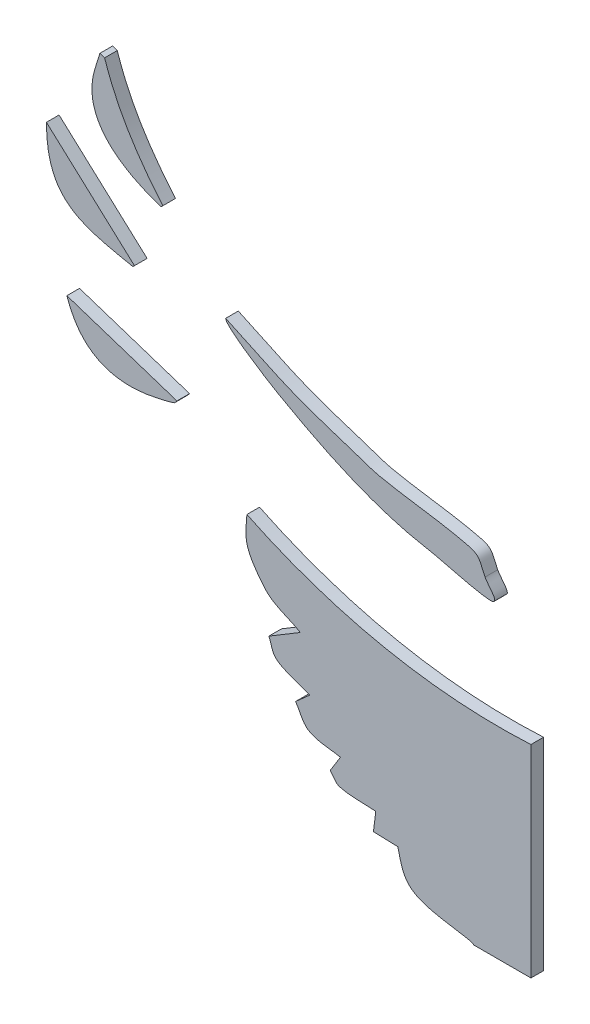
ISO-10303-21;
HEADER;
FILE_DESCRIPTION(('STEP AP214'),'2;1');
FILE_NAME('part.step','',(''),(''),'','','');
FILE_SCHEMA(('AUTOMOTIVE_DESIGN { 1 0 10303 214 1 1 1 1 }'));
ENDSEC;
DATA;
#1=APPLICATION_CONTEXT('core data for automotive mechanical design processes');
#2=APPLICATION_PROTOCOL_DEFINITION('international standard','automotive_design',2000,#1);
#3=PRODUCT_CONTEXT('',#1,'mechanical');
#4=PRODUCT('Part','Part','',(#3));
#5=PRODUCT_RELATED_PRODUCT_CATEGORY('part','',(#4));
#6=PRODUCT_DEFINITION_FORMATION('','',#4);
#7=PRODUCT_DEFINITION_CONTEXT('part definition',#1,'design');
#8=PRODUCT_DEFINITION('design','',#6,#7);
#9=PRODUCT_DEFINITION_SHAPE('','',#8);
#10=(LENGTH_UNIT() NAMED_UNIT(*) SI_UNIT(.MILLI.,.METRE.));
#11=(NAMED_UNIT(*) PLANE_ANGLE_UNIT() SI_UNIT($,.RADIAN.));
#12=(NAMED_UNIT(*) SI_UNIT($,.STERADIAN.) SOLID_ANGLE_UNIT());
#13=UNCERTAINTY_MEASURE_WITH_UNIT(LENGTH_MEASURE(1.E-05),#10,'distance_accuracy_value','');
#14=(GEOMETRIC_REPRESENTATION_CONTEXT(3) GLOBAL_UNCERTAINTY_ASSIGNED_CONTEXT((#13)) GLOBAL_UNIT_ASSIGNED_CONTEXT((#10,
#11,#12)) REPRESENTATION_CONTEXT('',''));
#15=CARTESIAN_POINT('',(0.,0.,0.));
#16=DIRECTION('',(0.,0.,1.));
#17=DIRECTION('',(1.,0.,0.));
#18=AXIS2_PLACEMENT_3D('',#15,#16,#17);
#19=CARTESIAN_POINT('',(-75.8399999999999,0.789999999999968,6.35));
#20=CARTESIAN_POINT('',(-78.7796213442979,6.6692426885958,6.35));
#21=CARTESIAN_POINT('',(-78.2156392015156,8.69140980037883,6.35));
#22=CARTESIAN_POINT('',(-84.53,10.27,6.35));
#23=CARTESIAN_POINT('',(-98.7672328266424,13.8293082066606,6.35));
#24=CARTESIAN_POINT('',(-114.58531411229,15.1611272359402,6.35));
#25=CARTESIAN_POINT('',(-128.77,18.17,6.35));
#26=CARTESIAN_POINT('',(-133.902676573185,19.25874957613,6.35));
#27=CARTESIAN_POINT('',(-138.769981558753,21.3513275960566,6.35));
#28=CARTESIAN_POINT('',(-143.78,22.9099999999999,6.35));
#29=CARTESIAN_POINT('',(-150.936267738309,25.136394407474,6.35));
#30=CARTESIAN_POINT('',(-158.036160998562,27.5441563494967,6.35));
#31=CARTESIAN_POINT('',(-165.11,30.02,6.35));
#32=CARTESIAN_POINT('',(-179.428985915574,35.0316450704508,6.35));
#33=CARTESIAN_POINT('',(-192.515030027746,42.1122355678873,6.35));
#34=CARTESIAN_POINT('',(-206.19,48.1899999999999,6.35));
#35=B_SPLINE_CURVE_WITH_KNOTS('',3,(#19,#20,#21,#22,#23,#24,#25,#26,#27,#28,#29,#30,#31,#32,#33,
#34),.UNSPECIFIED.,.F.,.F.,(4,3,3,3,3,4),(0.,1.,2.,3.,4.,5.),.UNSPECIFIED.);
#36=DIRECTION('',(0.,0.,-1.));
#37=VECTOR('',#36,1.);
#38=SURFACE_OF_LINEAR_EXTRUSION('',#35,#37);
#39=CARTESIAN_POINT('',(-75.8399999999999,0.789999999999968,0.));
#40=CARTESIAN_POINT('',(-78.7796213442979,6.6692426885958,0.));
#41=CARTESIAN_POINT('',(-78.2156392015156,8.69140980037883,0.));
#42=CARTESIAN_POINT('',(-84.53,10.27,0.));
#43=CARTESIAN_POINT('',(-98.7672328266424,13.8293082066606,0.));
#44=CARTESIAN_POINT('',(-114.58531411229,15.1611272359402,0.));
#45=CARTESIAN_POINT('',(-128.77,18.17,0.));
#46=CARTESIAN_POINT('',(-133.902676573185,19.25874957613,0.));
#47=CARTESIAN_POINT('',(-138.769981558753,21.3513275960566,0.));
#48=CARTESIAN_POINT('',(-143.78,22.9099999999999,0.));
#49=CARTESIAN_POINT('',(-150.936267738309,25.136394407474,0.));
#50=CARTESIAN_POINT('',(-158.036160998562,27.5441563494967,0.));
#51=CARTESIAN_POINT('',(-165.11,30.02,0.));
#52=CARTESIAN_POINT('',(-179.428985915574,35.0316450704508,0.));
#53=CARTESIAN_POINT('',(-192.515030027746,42.1122355678873,0.));
#54=CARTESIAN_POINT('',(-206.19,48.1899999999999,0.));
#55=B_SPLINE_CURVE_WITH_KNOTS('',3,(#39,#40,#41,#42,#43,#44,#45,#46,#47,#48,#49,#50,#51,#52,#53,
#54),.UNSPECIFIED.,.F.,.F.,(4,3,3,3,3,4),(0.,1.,2.,3.,4.,5.),.UNSPECIFIED.);
#56=CARTESIAN_POINT('',(-75.8399999999999,0.789999999999968,0.));
#57=VERTEX_POINT('',#56);
#58=CARTESIAN_POINT('',(-206.19,48.1899999999999,0.));
#59=VERTEX_POINT('',#58);
#60=EDGE_CURVE('E77',#57,#59,#55,.T.);
#61=ORIENTED_EDGE('',*,*,#60,.T.);
#62=DIRECTION('',(0.,0.,-1.));
#63=VECTOR('',#62,1.);
#64=CARTESIAN_POINT('',(-206.19,48.1899999999999,6.35));
#65=LINE('',#64,#63);
#66=CARTESIAN_POINT('',(-206.19,48.1899999999999,6.35));
#67=VERTEX_POINT('',#66);
#68=EDGE_CURVE('E12',#67,#59,#65,.T.);
#69=ORIENTED_EDGE('',*,*,#68,.F.);
#70=CARTESIAN_POINT('',(-75.8399999999999,0.789999999999968,6.35));
#71=VERTEX_POINT('',#70);
#72=EDGE_CURVE('E76',#71,#67,#35,.T.);
#73=ORIENTED_EDGE('',*,*,#72,.F.);
#74=DIRECTION('',(0.,0.,-1.));
#75=VECTOR('',#74,1.);
#76=CARTESIAN_POINT('',(-75.8399999999999,0.789999999999968,6.35));
#77=LINE('',#76,#75);
#78=EDGE_CURVE('E54',#71,#57,#77,.T.);
#79=ORIENTED_EDGE('',*,*,#78,.T.);
#80=EDGE_LOOP('',(#61,#69,#73,#79));
#81=FACE_BOUND('',#80,.T.);
#82=ADVANCED_FACE('F45',(#81),#38,.F.);
#83=CARTESIAN_POINT('',(-206.19,48.1899999999999,6.35));
#84=CARTESIAN_POINT('',(-206.19,44.7202303219831,6.35));
#85=CARTESIAN_POINT('',(-185.17030714785,31.6644612273428,6.35));
#86=CARTESIAN_POINT('',(-180.91,29.23,6.35));
#87=CARTESIAN_POINT('',(-160.26728455159,17.4341626009086,6.35));
#88=CARTESIAN_POINT('',(-138.429163031525,6.56229075788121,6.35));
#89=CARTESIAN_POINT('',(-115.34,0.789999999999968,6.35));
#90=CARTESIAN_POINT('',(-108.717916656089,-0.865520835977721,6.35));
#91=CARTESIAN_POINT('',(-106.320431811551,-0.872392047112246,6.35));
#92=CARTESIAN_POINT('',(-100.33,-2.37000000000001,6.35));
#93=CARTESIAN_POINT('',(-94.2252849477836,-3.89617876305413,6.35));
#94=CARTESIAN_POINT('',(-74.8655354359532,-8.94143740258369,6.35));
#95=CARTESIAN_POINT('',(-71.8899999999999,-7.90000000000005,6.35));
#96=CARTESIAN_POINT('',(-68.8867665696999,-6.84886829939502,6.35));
#97=CARTESIAN_POINT('',(-74.4170250255968,-2.05594994880647,6.35));
#98=CARTESIAN_POINT('',(-75.8399999999999,0.789999999999968,6.35));
#99=B_SPLINE_CURVE_WITH_KNOTS('',3,(#83,#84,#85,#86,#87,#88,#89,#90,#91,#92,#93,#94,#95,#96,#97,
#98),.UNSPECIFIED.,.F.,.F.,(4,3,3,3,3,4),(5.,6.,7.,8.,9.,10.),.UNSPECIFIED.);
#100=DIRECTION('',(0.,0.,-1.));
#101=VECTOR('',#100,1.);
#102=SURFACE_OF_LINEAR_EXTRUSION('',#99,#101);
#103=CARTESIAN_POINT('',(-206.19,48.1899999999999,0.));
#104=CARTESIAN_POINT('',(-206.19,44.7202303219831,0.));
#105=CARTESIAN_POINT('',(-185.17030714785,31.6644612273428,0.));
#106=CARTESIAN_POINT('',(-180.91,29.23,0.));
#107=CARTESIAN_POINT('',(-160.26728455159,17.4341626009086,0.));
#108=CARTESIAN_POINT('',(-138.429163031525,6.56229075788121,0.));
#109=CARTESIAN_POINT('',(-115.34,0.789999999999968,0.));
#110=CARTESIAN_POINT('',(-108.717916656089,-0.865520835977721,0.));
#111=CARTESIAN_POINT('',(-106.320431811551,-0.872392047112246,0.));
#112=CARTESIAN_POINT('',(-100.33,-2.37000000000001,0.));
#113=CARTESIAN_POINT('',(-94.2252849477836,-3.89617876305413,0.));
#114=CARTESIAN_POINT('',(-74.8655354359532,-8.94143740258369,0.));
#115=CARTESIAN_POINT('',(-71.8899999999999,-7.90000000000005,0.));
#116=CARTESIAN_POINT('',(-68.8867665696999,-6.84886829939502,0.));
#117=CARTESIAN_POINT('',(-74.4170250255968,-2.05594994880647,0.));
#118=CARTESIAN_POINT('',(-75.8399999999999,0.789999999999968,0.));
#119=B_SPLINE_CURVE_WITH_KNOTS('',3,(#103,#104,#105,#106,#107,#108,#109,#110,#111,#112,#113,
#114,#115,#116,#117,#118),.UNSPECIFIED.,.F.,.F.,(4,3,3,3,3,4),(5.,6.,7.,8.,9.,10.),.UNSPECIFIED.);
#120=EDGE_CURVE('E69',#59,#57,#119,.T.);
#121=ORIENTED_EDGE('',*,*,#120,.T.);
#122=ORIENTED_EDGE('',*,*,#78,.F.);
#123=EDGE_CURVE('E61',#67,#71,#99,.T.);
#124=ORIENTED_EDGE('',*,*,#123,.F.);
#125=ORIENTED_EDGE('',*,*,#68,.T.);
#126=EDGE_LOOP('',(#121,#122,#124,#125));
#127=FACE_BOUND('',#126,.T.);
#128=ADVANCED_FACE('F72',(#127),#102,.F.);
#129=CARTESIAN_POINT('',(-136.320996799477,20.36377893957,6.35));
#130=DIRECTION('',(0.,0.,1.));
#131=DIRECTION('',(1.,0.,0.));
#132=AXIS2_PLACEMENT_3D('',#129,#130,#131);
#133=PLANE('',#132);
#134=ORIENTED_EDGE('',*,*,#72,.T.);
#135=ORIENTED_EDGE('',*,*,#123,.T.);
#136=EDGE_LOOP('',(#134,#135));
#137=FACE_BOUND('',#136,.T.);
#138=ADVANCED_FACE('F104',(#137),#133,.T.);
#139=CARTESIAN_POINT('',(-136.320996799477,20.36377893957,0.));
#140=DIRECTION('',(0.,0.,1.));
#141=DIRECTION('',(1.,0.,0.));
#142=AXIS2_PLACEMENT_3D('',#139,#140,#141);
#143=PLANE('',#142);
#144=ORIENTED_EDGE('',*,*,#60,.F.);
#145=ORIENTED_EDGE('',*,*,#120,.F.);
#146=EDGE_LOOP('',(#144,#145));
#147=FACE_BOUND('',#146,.T.);
#148=ADVANCED_FACE('F80',(#147),#143,.F.);
#149=CLOSED_SHELL('',(#82,#128,#138,#148));
#150=MANIFOLD_SOLID_BREP('B2',#149);
#151=CARTESIAN_POINT('',(-269.39,131.93,6.35));
#152=CARTESIAN_POINT('',(-271.351774932323,124.736825248151,6.35));
#153=CARTESIAN_POINT('',(-273.723440825506,120.63881651013,6.35));
#154=CARTESIAN_POINT('',(-273.34,112.97,6.35));
#155=CARTESIAN_POINT('',(-272.443028073088,95.0305614617618,6.35));
#156=CARTESIAN_POINT('',(-253.095377483624,85.0462699949611,6.35));
#157=CARTESIAN_POINT('',(-238.58,80.58,6.35));
#158=B_SPLINE_CURVE_WITH_KNOTS('',3,(#151,#152,#153,#154,#155,#156,#157),.UNSPECIFIED.,.F.,.F.,
(4,3,4),(0.,1.,2.),.UNSPECIFIED.);
#159=DIRECTION('',(0.,0.,-1.));
#160=VECTOR('',#159,1.);
#161=SURFACE_OF_LINEAR_EXTRUSION('',#158,#160);
#162=CARTESIAN_POINT('',(-269.39,131.93,0.));
#163=CARTESIAN_POINT('',(-271.351774932323,124.736825248151,0.));
#164=CARTESIAN_POINT('',(-273.723440825506,120.63881651013,0.));
#165=CARTESIAN_POINT('',(-273.34,112.97,0.));
#166=CARTESIAN_POINT('',(-272.443028073088,95.0305614617618,0.));
#167=CARTESIAN_POINT('',(-253.095377483624,85.0462699949611,0.));
#168=CARTESIAN_POINT('',(-238.58,80.58,0.));
#169=B_SPLINE_CURVE_WITH_KNOTS('',3,(#162,#163,#164,#165,#166,#167,#168),.UNSPECIFIED.,.F.,.F.,
(4,3,4),(0.,1.,2.),.UNSPECIFIED.);
#170=CARTESIAN_POINT('',(-269.39,131.93,0.));
#171=VERTEX_POINT('',#170);
#172=CARTESIAN_POINT('',(-238.58,80.58,0.));
#173=VERTEX_POINT('',#172);
#174=EDGE_CURVE('E231',#171,#173,#169,.T.);
#175=ORIENTED_EDGE('',*,*,#174,.T.);
#176=DIRECTION('',(0.,0.,-1.));
#177=VECTOR('',#176,1.);
#178=CARTESIAN_POINT('',(-238.58,80.58,6.35));
#179=LINE('',#178,#177);
#180=CARTESIAN_POINT('',(-238.58,80.58,6.35));
#181=VERTEX_POINT('',#180);
#182=EDGE_CURVE('E43',#181,#173,#179,.T.);
#183=ORIENTED_EDGE('',*,*,#182,.F.);
#184=CARTESIAN_POINT('',(-269.39,131.93,6.35));
#185=VERTEX_POINT('',#184);
#186=EDGE_CURVE('E200',#185,#181,#158,.T.);
#187=ORIENTED_EDGE('',*,*,#186,.F.);
#188=DIRECTION('',(0.,0.,-1.));
#189=VECTOR('',#188,1.);
#190=CARTESIAN_POINT('',(-269.39,131.93,6.35));
#191=LINE('',#190,#189);
#192=EDGE_CURVE('E208',#185,#171,#191,.T.);
#193=ORIENTED_EDGE('',*,*,#192,.T.);
#194=EDGE_LOOP('',(#175,#183,#187,#193));
#195=FACE_BOUND('',#194,.T.);
#196=ADVANCED_FACE('F148',(#195),#161,.F.);
#197=CARTESIAN_POINT('',(-237.79,81.37,6.35));
#198=DIRECTION('',(-0.707106781186541,0.707106781186554,0.));
#199=DIRECTION('',(-0.707106781186554,-0.707106781186541,0.));
#200=AXIS2_PLACEMENT_3D('',#197,#198,#199);
#201=PLANE('',#200);
#202=DIRECTION('',(0.707106781186554,0.707106781186541,0.));
#203=VECTOR('',#202,1.);
#204=CARTESIAN_POINT('',(-237.79,81.37,0.));
#205=LINE('',#204,#203);
#206=CARTESIAN_POINT('',(-237.79,81.37,0.));
#207=VERTEX_POINT('',#206);
#208=EDGE_CURVE('E204',#173,#207,#205,.T.);
#209=ORIENTED_EDGE('',*,*,#208,.T.);
#210=DIRECTION('',(0.,0.,-1.));
#211=VECTOR('',#210,1.);
#212=CARTESIAN_POINT('',(-237.79,81.37,6.35));
#213=LINE('',#212,#211);
#214=CARTESIAN_POINT('',(-237.79,81.37,6.35));
#215=VERTEX_POINT('',#214);
#216=EDGE_CURVE('E157',#215,#207,#213,.T.);
#217=ORIENTED_EDGE('',*,*,#216,.F.);
#218=DIRECTION('',(0.707106781186554,0.707106781186541,0.));
#219=VECTOR('',#218,1.);
#220=CARTESIAN_POINT('',(-237.79,81.37,6.35));
#221=LINE('',#220,#219);
#222=EDGE_CURVE('E195',#181,#215,#221,.T.);
#223=ORIENTED_EDGE('',*,*,#222,.F.);
#224=ORIENTED_EDGE('',*,*,#182,.T.);
#225=EDGE_LOOP('',(#209,#217,#223,#224));
#226=FACE_BOUND('',#225,.T.);
#227=ADVANCED_FACE('F203',(#226),#201,.F.);
#228=CARTESIAN_POINT('',(-237.79,81.37,6.35));
#229=CARTESIAN_POINT('',(-250.910297668171,97.1143572018057,6.35));
#230=CARTESIAN_POINT('',(-260.55769586978,111.753087609339,6.35));
#231=CARTESIAN_POINT('',(-267.02,131.14,6.35));
#232=B_SPLINE_CURVE_WITH_KNOTS('',3,(#228,#229,#230,#231),.UNSPECIFIED.,.F.,.F.,(4,4),(0.,1.),.UNSPECIFIED.);
#233=DIRECTION('',(0.,0.,-1.));
#234=VECTOR('',#233,1.);
#235=SURFACE_OF_LINEAR_EXTRUSION('',#232,#234);
#236=CARTESIAN_POINT('',(-237.79,81.37,0.));
#237=CARTESIAN_POINT('',(-250.910297668171,97.1143572018057,0.));
#238=CARTESIAN_POINT('',(-260.55769586978,111.753087609339,0.));
#239=CARTESIAN_POINT('',(-267.02,131.14,0.));
#240=B_SPLINE_CURVE_WITH_KNOTS('',3,(#236,#237,#238,#239),.UNSPECIFIED.,.F.,.F.,(4,4),(0.,1.),.UNSPECIFIED.);
#241=CARTESIAN_POINT('',(-267.02,131.14,0.));
#242=VERTEX_POINT('',#241);
#243=EDGE_CURVE('E182',#207,#242,#240,.T.);
#244=ORIENTED_EDGE('',*,*,#243,.T.);
#245=DIRECTION('',(0.,0.,-1.));
#246=VECTOR('',#245,1.);
#247=CARTESIAN_POINT('',(-267.02,131.14,6.35));
#248=LINE('',#247,#246);
#249=CARTESIAN_POINT('',(-267.02,131.14,6.35));
#250=VERTEX_POINT('',#249);
#251=EDGE_CURVE('E205',#250,#242,#248,.T.);
#252=ORIENTED_EDGE('',*,*,#251,.F.);
#253=EDGE_CURVE('E198',#215,#250,#232,.T.);
#254=ORIENTED_EDGE('',*,*,#253,.F.);
#255=ORIENTED_EDGE('',*,*,#216,.T.);
#256=EDGE_LOOP('',(#244,#252,#254,#255));
#257=FACE_BOUND('',#256,.T.);
#258=ADVANCED_FACE('F206',(#257),#235,.F.);
#259=CARTESIAN_POINT('',(-269.39,131.93,6.35));
#260=DIRECTION('',(-0.316227766016808,-0.948683298050524,0.));
#261=DIRECTION('',(0.948683298050524,-0.316227766016808,0.));
#262=AXIS2_PLACEMENT_3D('',#259,#260,#261);
#263=PLANE('',#262);
#264=DIRECTION('',(-0.948683298050524,0.316227766016808,0.));
#265=VECTOR('',#264,1.);
#266=CARTESIAN_POINT('',(-269.39,131.93,0.));
#267=LINE('',#266,#265);
#268=EDGE_CURVE('E188',#242,#171,#267,.T.);
#269=ORIENTED_EDGE('',*,*,#268,.T.);
#270=ORIENTED_EDGE('',*,*,#192,.F.);
#271=DIRECTION('',(-0.948683298050524,0.316227766016808,0.));
#272=VECTOR('',#271,1.);
#273=CARTESIAN_POINT('',(-269.39,131.93,6.35));
#274=LINE('',#273,#272);
#275=EDGE_CURVE('E165',#250,#185,#274,.T.);
#276=ORIENTED_EDGE('',*,*,#275,.F.);
#277=ORIENTED_EDGE('',*,*,#251,.T.);
#278=EDGE_LOOP('',(#269,#270,#276,#277));
#279=FACE_BOUND('',#278,.T.);
#280=ADVANCED_FACE('F220',(#279),#263,.F.);
#281=CARTESIAN_POINT('',(-273.34,112.97,6.35));
#282=DIRECTION('',(0.,0.,1.));
#283=DIRECTION('',(1.,0.,0.));
#284=AXIS2_PLACEMENT_3D('',#281,#282,#283);
#285=PLANE('',#284);
#286=ORIENTED_EDGE('',*,*,#186,.T.);
#287=ORIENTED_EDGE('',*,*,#222,.T.);
#288=ORIENTED_EDGE('',*,*,#253,.T.);
#289=ORIENTED_EDGE('',*,*,#275,.T.);
#290=EDGE_LOOP('',(#286,#287,#288,#289));
#291=FACE_BOUND('',#290,.T.);
#292=ADVANCED_FACE('F196',(#291),#285,.T.);
#293=CARTESIAN_POINT('',(-273.34,112.97,0.));
#294=DIRECTION('',(0.,0.,1.));
#295=DIRECTION('',(1.,0.,0.));
#296=AXIS2_PLACEMENT_3D('',#293,#294,#295);
#297=PLANE('',#296);
#298=ORIENTED_EDGE('',*,*,#174,.F.);
#299=ORIENTED_EDGE('',*,*,#268,.F.);
#300=ORIENTED_EDGE('',*,*,#243,.F.);
#301=ORIENTED_EDGE('',*,*,#208,.F.);
#302=EDGE_LOOP('',(#298,#299,#300,#301));
#303=FACE_BOUND('',#302,.T.);
#304=ADVANCED_FACE('F248',(#303),#297,.F.);
#305=CLOSED_SHELL('',(#196,#227,#258,#280,#292,#304));
#306=MANIFOLD_SOLID_BREP('B6',#305);
#307=CARTESIAN_POINT('',(-296.25,88.48,6.35));
#308=CARTESIAN_POINT('',(-296.25,56.1108095903687,6.35));
#309=CARTESIAN_POINT('',(-279.541078636927,52.7482157273854,6.35));
#310=CARTESIAN_POINT('',(-252.8,47.3999999999999,6.35));
#311=B_SPLINE_CURVE_WITH_KNOTS('',3,(#307,#308,#309,#310),.UNSPECIFIED.,.F.,.F.,(4,4),(0.,1.),.UNSPECIFIED.);
#312=DIRECTION('',(0.,0.,-1.));
#313=VECTOR('',#312,1.);
#314=SURFACE_OF_LINEAR_EXTRUSION('',#311,#313);
#315=CARTESIAN_POINT('',(-296.25,88.48,0.));
#316=CARTESIAN_POINT('',(-296.25,56.1108095903687,0.));
#317=CARTESIAN_POINT('',(-279.541078636927,52.7482157273854,0.));
#318=CARTESIAN_POINT('',(-252.8,47.3999999999999,0.));
#319=B_SPLINE_CURVE_WITH_KNOTS('',3,(#315,#316,#317,#318),.UNSPECIFIED.,.F.,.F.,(4,4),(0.,1.),.UNSPECIFIED.);
#320=CARTESIAN_POINT('',(-296.25,88.48,0.));
#321=VERTEX_POINT('',#320);
#322=CARTESIAN_POINT('',(-252.8,47.3999999999999,0.));
#323=VERTEX_POINT('',#322);
#324=EDGE_CURVE('E350',#321,#323,#319,.T.);
#325=ORIENTED_EDGE('',*,*,#324,.T.);
#326=DIRECTION('',(0.,0.,-1.));
#327=VECTOR('',#326,1.);
#328=CARTESIAN_POINT('',(-252.8,47.3999999999999,6.35));
#329=LINE('',#328,#327);
#330=CARTESIAN_POINT('',(-252.8,47.3999999999999,6.35));
#331=VERTEX_POINT('',#330);
#332=EDGE_CURVE('E146',#331,#323,#329,.T.);
#333=ORIENTED_EDGE('',*,*,#332,.F.);
#334=CARTESIAN_POINT('',(-296.25,88.48,6.35));
#335=VERTEX_POINT('',#334);
#336=EDGE_CURVE('E344',#335,#331,#311,.T.);
#337=ORIENTED_EDGE('',*,*,#336,.F.);
#338=DIRECTION('',(0.,0.,-1.));
#339=VECTOR('',#338,1.);
#340=CARTESIAN_POINT('',(-296.25,88.48,6.35));
#341=LINE('',#340,#339);
#342=EDGE_CURVE('E351',#335,#321,#341,.T.);
#343=ORIENTED_EDGE('',*,*,#342,.T.);
#344=EDGE_LOOP('',(#325,#333,#337,#343));
#345=FACE_BOUND('',#344,.T.);
#346=ADVANCED_FACE('F303',(#345),#314,.F.);
#347=CARTESIAN_POINT('',(-252.01,48.1899999999999,6.35));
#348=DIRECTION('',(-0.707106781186572,0.707106781186523,0.));
#349=DIRECTION('',(-0.707106781186523,-0.707106781186572,0.));
#350=AXIS2_PLACEMENT_3D('',#347,#348,#349);
#351=PLANE('',#350);
#352=DIRECTION('',(0.707106781186523,0.707106781186572,0.));
#353=VECTOR('',#352,1.);
#354=CARTESIAN_POINT('',(-252.01,48.1899999999999,0.));
#355=LINE('',#354,#353);
#356=CARTESIAN_POINT('',(-252.01,48.1899999999999,0.));
#357=VERTEX_POINT('',#356);
#358=EDGE_CURVE('E332',#323,#357,#355,.T.);
#359=ORIENTED_EDGE('',*,*,#358,.T.);
#360=DIRECTION('',(0.,0.,-1.));
#361=VECTOR('',#360,1.);
#362=CARTESIAN_POINT('',(-252.01,48.1899999999999,6.35));
#363=LINE('',#362,#361);
#364=CARTESIAN_POINT('',(-252.01,48.1899999999999,6.35));
#365=VERTEX_POINT('',#364);
#366=EDGE_CURVE('E312',#365,#357,#363,.T.);
#367=ORIENTED_EDGE('',*,*,#366,.F.);
#368=DIRECTION('',(0.707106781186523,0.707106781186572,0.));
#369=VECTOR('',#368,1.);
#370=CARTESIAN_POINT('',(-252.01,48.1899999999999,6.35));
#371=LINE('',#370,#369);
#372=EDGE_CURVE('E340',#331,#365,#371,.T.);
#373=ORIENTED_EDGE('',*,*,#372,.F.);
#374=ORIENTED_EDGE('',*,*,#332,.T.);
#375=EDGE_LOOP('',(#359,#367,#373,#374));
#376=FACE_BOUND('',#375,.T.);
#377=ADVANCED_FACE('F341',(#376),#351,.F.);
#378=CARTESIAN_POINT('',(-296.25,88.48,6.35));
#379=DIRECTION('',(-0.673329668846753,-0.739342381478786,0.));
#380=DIRECTION('',(0.739342381478786,-0.673329668846753,0.));
#381=AXIS2_PLACEMENT_3D('',#378,#379,#380);
#382=PLANE('',#381);
#383=DIRECTION('',(-0.739342381478786,0.673329668846753,0.));
#384=VECTOR('',#383,1.);
#385=CARTESIAN_POINT('',(-296.25,88.48,0.));
#386=LINE('',#385,#384);
#387=EDGE_CURVE('E337',#357,#321,#386,.T.);
#388=ORIENTED_EDGE('',*,*,#387,.T.);
#389=ORIENTED_EDGE('',*,*,#342,.F.);
#390=DIRECTION('',(-0.739342381478786,0.673329668846753,0.));
#391=VECTOR('',#390,1.);
#392=CARTESIAN_POINT('',(-296.25,88.48,6.35));
#393=LINE('',#392,#391);
#394=EDGE_CURVE('E320',#365,#335,#393,.T.);
#395=ORIENTED_EDGE('',*,*,#394,.F.);
#396=ORIENTED_EDGE('',*,*,#366,.T.);
#397=EDGE_LOOP('',(#388,#389,#395,#396));
#398=FACE_BOUND('',#397,.T.);
#399=ADVANCED_FACE('F363',(#398),#382,.F.);
#400=CARTESIAN_POINT('',(-284.552904488848,57.8071344941578,6.35));
#401=DIRECTION('',(0.,0.,1.));
#402=DIRECTION('',(1.,0.,0.));
#403=AXIS2_PLACEMENT_3D('',#400,#401,#402);
#404=PLANE('',#403);
#405=ORIENTED_EDGE('',*,*,#336,.T.);
#406=ORIENTED_EDGE('',*,*,#372,.T.);
#407=ORIENTED_EDGE('',*,*,#394,.T.);
#408=EDGE_LOOP('',(#405,#406,#407));
#409=FACE_BOUND('',#408,.T.);
#410=ADVANCED_FACE('F347',(#409),#404,.T.);
#411=CARTESIAN_POINT('',(-284.552904488848,57.8071344941578,0.));
#412=DIRECTION('',(0.,0.,1.));
#413=DIRECTION('',(1.,0.,0.));
#414=AXIS2_PLACEMENT_3D('',#411,#412,#413);
#415=PLANE('',#414);
#416=ORIENTED_EDGE('',*,*,#324,.F.);
#417=ORIENTED_EDGE('',*,*,#387,.F.);
#418=ORIENTED_EDGE('',*,*,#358,.F.);
#419=EDGE_LOOP('',(#416,#417,#418));
#420=FACE_BOUND('',#419,.T.);
#421=ADVANCED_FACE('F364',(#420),#415,.F.);
#422=CLOSED_SHELL('',(#346,#377,#399,#410,#421));
#423=MANIFOLD_SOLID_BREP('B37',#422);
#424=CARTESIAN_POINT('',(-285.98,18.17,6.35));
#425=CARTESIAN_POINT('',(-278.996639843468,-2.78008046959578,6.35));
#426=CARTESIAN_POINT('',(-262.618523721473,-8.29969244197365,6.35));
#427=CARTESIAN_POINT('',(-241.74,-3.95000000000004,6.35));
#428=CARTESIAN_POINT('',(-238.551212655968,-3.28566930332676,6.35));
#429=CARTESIAN_POINT('',(-235.327492085125,-2.67553288754487,6.35));
#430=CARTESIAN_POINT('',(-232.26,-1.58000000000002,6.35));
#431=CARTESIAN_POINT('',(-231.55857259662,-1.3294902130787,6.35));
#432=CARTESIAN_POINT('',(-231.206666666667,-0.526666666666718,6.35));
#433=CARTESIAN_POINT('',(-230.68,0.,6.35));
#434=B_SPLINE_CURVE_WITH_KNOTS('',3,(#424,#425,#426,#427,#428,#429,#430,#431,#432,#433),
.UNSPECIFIED.,.F.,.F.,(4,3,3,4),(0.,1.,2.,3.),.UNSPECIFIED.);
#435=DIRECTION('',(0.,0.,-1.));
#436=VECTOR('',#435,1.);
#437=SURFACE_OF_LINEAR_EXTRUSION('',#434,#436);
#438=CARTESIAN_POINT('',(-285.98,18.17,0.));
#439=CARTESIAN_POINT('',(-278.996639843468,-2.78008046959578,0.));
#440=CARTESIAN_POINT('',(-262.618523721473,-8.29969244197365,0.));
#441=CARTESIAN_POINT('',(-241.74,-3.95000000000004,0.));
#442=CARTESIAN_POINT('',(-238.551212655968,-3.28566930332676,0.));
#443=CARTESIAN_POINT('',(-235.327492085125,-2.67553288754487,0.));
#444=CARTESIAN_POINT('',(-232.26,-1.58000000000002,0.));
#445=CARTESIAN_POINT('',(-231.55857259662,-1.3294902130787,0.));
#446=CARTESIAN_POINT('',(-231.206666666667,-0.526666666666718,0.));
#447=CARTESIAN_POINT('',(-230.68,0.,0.));
#448=B_SPLINE_CURVE_WITH_KNOTS('',3,(#438,#439,#440,#441,#442,#443,#444,#445,#446,#447),
.UNSPECIFIED.,.F.,.F.,(4,3,3,4),(0.,1.,2.,3.),.UNSPECIFIED.);
#449=CARTESIAN_POINT('',(-285.98,18.17,0.));
#450=VERTEX_POINT('',#449);
#451=CARTESIAN_POINT('',(-230.68,0.,0.));
#452=VERTEX_POINT('',#451);
#453=EDGE_CURVE('E452',#450,#452,#448,.T.);
#454=ORIENTED_EDGE('',*,*,#453,.T.);
#455=DIRECTION('',(0.,0.,-1.));
#456=VECTOR('',#455,1.);
#457=CARTESIAN_POINT('',(-230.68,0.,6.35));
#458=LINE('',#457,#456);
#459=CARTESIAN_POINT('',(-230.68,0.,6.35));
#460=VERTEX_POINT('',#459);
#461=EDGE_CURVE('E301',#460,#452,#458,.T.);
#462=ORIENTED_EDGE('',*,*,#461,.F.);
#463=CARTESIAN_POINT('',(-285.98,18.17,6.35));
#464=VERTEX_POINT('',#463);
#465=EDGE_CURVE('E451',#464,#460,#434,.T.);
#466=ORIENTED_EDGE('',*,*,#465,.F.);
#467=DIRECTION('',(0.,0.,-1.));
#468=VECTOR('',#467,1.);
#469=CARTESIAN_POINT('',(-285.98,18.17,6.35));
#470=LINE('',#469,#468);
#471=EDGE_CURVE('E429',#464,#450,#470,.T.);
#472=ORIENTED_EDGE('',*,*,#471,.T.);
#473=EDGE_LOOP('',(#454,#462,#466,#472));
#474=FACE_BOUND('',#473,.T.);
#475=ADVANCED_FACE('F420',(#474),#437,.F.);
#476=CARTESIAN_POINT('',(-285.98,18.17,6.35));
#477=DIRECTION('',(-0.312153288970447,-0.95003174904049,0.));
#478=DIRECTION('',(0.95003174904049,-0.312153288970447,0.));
#479=AXIS2_PLACEMENT_3D('',#476,#477,#478);
#480=PLANE('',#479);
#481=DIRECTION('',(-0.95003174904049,0.312153288970447,0.));
#482=VECTOR('',#481,1.);
#483=CARTESIAN_POINT('',(-285.98,18.17,0.));
#484=LINE('',#483,#482);
#485=EDGE_CURVE('E444',#452,#450,#484,.T.);
#486=ORIENTED_EDGE('',*,*,#485,.T.);
#487=ORIENTED_EDGE('',*,*,#471,.F.);
#488=DIRECTION('',(-0.95003174904049,0.312153288970447,0.));
#489=VECTOR('',#488,1.);
#490=CARTESIAN_POINT('',(-285.98,18.17,6.35));
#491=LINE('',#490,#489);
#492=EDGE_CURVE('E436',#460,#464,#491,.T.);
#493=ORIENTED_EDGE('',*,*,#492,.F.);
#494=ORIENTED_EDGE('',*,*,#461,.T.);
#495=EDGE_LOOP('',(#486,#487,#493,#494));
#496=FACE_BOUND('',#495,.T.);
#497=ADVANCED_FACE('F447',(#496),#480,.F.);
#498=CARTESIAN_POINT('',(-236.95451427791,-2.92670082157687,6.35));
#499=DIRECTION('',(0.,0.,-1.));
#500=DIRECTION('',(-1.,0.,0.));
#501=AXIS2_PLACEMENT_3D('',#498,#499,#500);
#502=PLANE('',#501);
#503=ORIENTED_EDGE('',*,*,#465,.T.);
#504=ORIENTED_EDGE('',*,*,#492,.T.);
#505=EDGE_LOOP('',(#503,#504));
#506=FACE_BOUND('',#505,.T.);
#507=ADVANCED_FACE('F469',(#506),#502,.F.);
#508=CARTESIAN_POINT('',(-236.95451427791,-2.92670082157687,0.));
#509=DIRECTION('',(0.,0.,-1.));
#510=DIRECTION('',(-1.,0.,0.));
#511=AXIS2_PLACEMENT_3D('',#508,#509,#510);
#512=PLANE('',#511);
#513=ORIENTED_EDGE('',*,*,#453,.F.);
#514=ORIENTED_EDGE('',*,*,#485,.F.);
#515=EDGE_LOOP('',(#513,#514));
#516=FACE_BOUND('',#515,.T.);
#517=ADVANCED_FACE('F455',(#516),#512,.T.);
#518=CLOSED_SHELL('',(#475,#497,#507,#517));
#519=MANIFOLD_SOLID_BREP('B140',#518);
#520=CARTESIAN_POINT('',(-195.525000000017,-31.8300000000231,6.35));
#521=CARTESIAN_POINT('',(-196.411209149186,-42.4645097900569,6.35));
#522=CARTESIAN_POINT('',(-197.436532474239,-46.1787865531435,6.35));
#523=CARTESIAN_POINT('',(-186.835000000016,-59.085000000023,6.35));
#524=CARTESIAN_POINT('',(-182.377283455853,-64.5117853581341,6.35));
#525=CARTESIAN_POINT('',(-174.721666666683,-66.1950000000228,6.35));
#526=CARTESIAN_POINT('',(-168.665000000016,-69.7500000000228,6.35));
#527=B_SPLINE_CURVE_WITH_KNOTS('',3,(#520,#521,#522,#523,#524,#525,#526),.UNSPECIFIED.,.F.,.F.,
(4,3,4),(0.,1.,2.),.UNSPECIFIED.);
#528=DIRECTION('',(0.,0.,-1.));
#529=VECTOR('',#528,1.);
#530=SURFACE_OF_LINEAR_EXTRUSION('',#527,#529);
#531=CARTESIAN_POINT('',(-195.525000000017,-31.8300000000231,0.));
#532=CARTESIAN_POINT('',(-196.411209149186,-42.4645097900569,0.));
#533=CARTESIAN_POINT('',(-197.436532474239,-46.1787865531435,0.));
#534=CARTESIAN_POINT('',(-186.835000000016,-59.085000000023,0.));
#535=CARTESIAN_POINT('',(-182.377283455853,-64.5117853581341,0.));
#536=CARTESIAN_POINT('',(-174.721666666683,-66.1950000000228,0.));
#537=CARTESIAN_POINT('',(-168.665000000016,-69.7500000000228,0.));
#538=B_SPLINE_CURVE_WITH_KNOTS('',3,(#531,#532,#533,#534,#535,#536,#537),.UNSPECIFIED.,.F.,.F.,
(4,3,4),(0.,1.,2.),.UNSPECIFIED.);
#539=CARTESIAN_POINT('',(-195.525000000017,-31.8300000000231,0.));
#540=VERTEX_POINT('',#539);
#541=CARTESIAN_POINT('',(-168.665000000016,-69.7500000000228,0.));
#542=VERTEX_POINT('',#541);
#543=EDGE_CURVE('E629',#540,#542,#538,.T.);
#544=ORIENTED_EDGE('',*,*,#543,.T.);
#545=DIRECTION('',(0.,0.,-1.));
#546=VECTOR('',#545,1.);
#547=CARTESIAN_POINT('',(-168.665000000016,-69.7500000000228,6.35));
#548=LINE('',#547,#546);
#549=CARTESIAN_POINT('',(-168.665000000016,-69.7500000000228,6.35));
#550=VERTEX_POINT('',#549);
#551=EDGE_CURVE('E418',#550,#542,#548,.T.);
#552=ORIENTED_EDGE('',*,*,#551,.F.);
#553=CARTESIAN_POINT('',(-195.525000000017,-31.8300000000231,6.35));
#554=VERTEX_POINT('',#553);
#555=EDGE_CURVE('E678',#554,#550,#527,.T.);
#556=ORIENTED_EDGE('',*,*,#555,.F.);
#557=DIRECTION('',(0.,0.,-1.));
#558=VECTOR('',#557,1.);
#559=CARTESIAN_POINT('',(-195.525000000017,-31.8300000000231,6.35));
#560=LINE('',#559,#558);
#561=EDGE_CURVE('E625',#554,#540,#560,.T.);
#562=ORIENTED_EDGE('',*,*,#561,.T.);
#563=EDGE_LOOP('',(#544,#552,#556,#562));
#564=FACE_BOUND('',#563,.T.);
#565=ADVANCED_FACE('F502',(#564),#530,.F.);
#566=CARTESIAN_POINT('',(-168.665000000016,-69.7500000000228,6.35));
#567=DIRECTION('',(0.514495755427537,-0.857492925712538,0.));
#568=DIRECTION('',(0.857492925712538,0.514495755427537,0.));
#569=AXIS2_PLACEMENT_3D('',#566,#567,#568);
#570=PLANE('',#569);
#571=DIRECTION('',(-0.857492925712538,-0.514495755427537,0.));
#572=VECTOR('',#571,1.);
#573=CARTESIAN_POINT('',(-168.665000000016,-69.7500000000228,0.));
#574=LINE('',#573,#572);
#575=CARTESIAN_POINT('',(-184.465000000016,-79.230000000023,0.));
#576=VERTEX_POINT('',#575);
#577=EDGE_CURVE('E634',#542,#576,#574,.T.);
#578=ORIENTED_EDGE('',*,*,#577,.T.);
#579=DIRECTION('',(0.,0.,-1.));
#580=VECTOR('',#579,1.);
#581=CARTESIAN_POINT('',(-184.465000000016,-79.230000000023,6.35));
#582=LINE('',#581,#580);
#583=CARTESIAN_POINT('',(-184.465000000016,-79.230000000023,6.35));
#584=VERTEX_POINT('',#583);
#585=EDGE_CURVE('E511',#584,#576,#582,.T.);
#586=ORIENTED_EDGE('',*,*,#585,.F.);
#587=DIRECTION('',(-0.857492925712538,-0.514495755427537,0.));
#588=VECTOR('',#587,1.);
#589=CARTESIAN_POINT('',(-168.665000000016,-69.7500000000228,6.35));
#590=LINE('',#589,#588);
#591=EDGE_CURVE('E577',#550,#584,#590,.T.);
#592=ORIENTED_EDGE('',*,*,#591,.F.);
#593=ORIENTED_EDGE('',*,*,#551,.T.);
#594=EDGE_LOOP('',(#578,#586,#592,#593));
#595=FACE_BOUND('',#594,.T.);
#596=ADVANCED_FACE('F748',(#595),#570,.F.);
#597=CARTESIAN_POINT('',(-184.465000000016,-79.230000000023,6.35));
#598=CARTESIAN_POINT('',(-183.148333333349,-81.995000000023,6.35));
#599=CARTESIAN_POINT('',(-182.964990839001,-85.6875068707841,6.35));
#600=CARTESIAN_POINT('',(-180.515000000016,-87.5250000000229,6.35));
#601=CARTESIAN_POINT('',(-175.70183139711,-91.1348764522023,6.35));
#602=CARTESIAN_POINT('',(-169.455000000016,-92.2650000000228,6.35));
#603=CARTESIAN_POINT('',(-163.925000000016,-94.6350000000227,6.35));
#604=B_SPLINE_CURVE_WITH_KNOTS('',3,(#597,#598,#599,#600,#601,#602,#603),.UNSPECIFIED.,.F.,.F.,
(4,3,4),(0.,1.,2.),.UNSPECIFIED.);
#605=DIRECTION('',(0.,0.,-1.));
#606=VECTOR('',#605,1.);
#607=SURFACE_OF_LINEAR_EXTRUSION('',#604,#606);
#608=CARTESIAN_POINT('',(-184.465000000016,-79.230000000023,0.));
#609=CARTESIAN_POINT('',(-183.148333333349,-81.995000000023,0.));
#610=CARTESIAN_POINT('',(-182.964990839001,-85.6875068707841,0.));
#611=CARTESIAN_POINT('',(-180.515000000016,-87.5250000000229,0.));
#612=CARTESIAN_POINT('',(-175.70183139711,-91.1348764522023,0.));
#613=CARTESIAN_POINT('',(-169.455000000016,-92.2650000000228,0.));
#614=CARTESIAN_POINT('',(-163.925000000016,-94.6350000000227,0.));
#615=B_SPLINE_CURVE_WITH_KNOTS('',3,(#608,#609,#610,#611,#612,#613,#614),.UNSPECIFIED.,.F.,.F.,
(4,3,4),(0.,1.,2.),.UNSPECIFIED.);
#616=CARTESIAN_POINT('',(-163.925000000016,-94.6350000000227,0.));
#617=VERTEX_POINT('',#616);
#618=EDGE_CURVE('E639',#576,#617,#615,.T.);
#619=ORIENTED_EDGE('',*,*,#618,.T.);
#620=DIRECTION('',(0.,0.,-1.));
#621=VECTOR('',#620,1.);
#622=CARTESIAN_POINT('',(-163.925000000016,-94.6350000000227,6.35));
#623=LINE('',#622,#621);
#624=CARTESIAN_POINT('',(-163.925000000016,-94.6350000000227,6.35));
#625=VERTEX_POINT('',#624);
#626=EDGE_CURVE('E700',#625,#617,#623,.T.);
#627=ORIENTED_EDGE('',*,*,#626,.F.);
#628=EDGE_CURVE('E708',#584,#625,#604,.T.);
#629=ORIENTED_EDGE('',*,*,#628,.F.);
#630=ORIENTED_EDGE('',*,*,#585,.T.);
#631=EDGE_LOOP('',(#619,#627,#629,#630));
#632=FACE_BOUND('',#631,.T.);
#633=ADVANCED_FACE('F706',(#632),#607,.F.);
#634=CARTESIAN_POINT('',(-163.925000000016,-94.6350000000227,6.35));
#635=DIRECTION('',(0.664363838829931,-0.74740931868365,0.));
#636=DIRECTION('',(0.747409318683649,0.664363838829931,0.));
#637=AXIS2_PLACEMENT_3D('',#634,#635,#636);
#638=PLANE('',#637);
#639=DIRECTION('',(-0.747409318683649,-0.664363838829931,0.));
#640=VECTOR('',#639,1.);
#641=CARTESIAN_POINT('',(-163.925000000016,-94.6350000000227,0.));
#642=LINE('',#641,#640);
#643=CARTESIAN_POINT('',(-171.035000000016,-100.955000000023,0.));
#644=VERTEX_POINT('',#643);
#645=EDGE_CURVE('E643',#617,#644,#642,.T.);
#646=ORIENTED_EDGE('',*,*,#645,.T.);
#647=DIRECTION('',(0.,0.,-1.));
#648=VECTOR('',#647,1.);
#649=CARTESIAN_POINT('',(-171.035000000016,-100.955000000023,6.35));
#650=LINE('',#649,#648);
#651=CARTESIAN_POINT('',(-171.035000000016,-100.955000000023,6.35));
#652=VERTEX_POINT('',#651);
#653=EDGE_CURVE('E697',#652,#644,#650,.T.);
#654=ORIENTED_EDGE('',*,*,#653,.F.);
#655=DIRECTION('',(-0.747409318683649,-0.664363838829931,0.));
#656=VECTOR('',#655,1.);
#657=CARTESIAN_POINT('',(-163.925000000016,-94.6350000000227,6.35));
#658=LINE('',#657,#656);
#659=EDGE_CURVE('E726',#625,#652,#658,.T.);
#660=ORIENTED_EDGE('',*,*,#659,.F.);
#661=ORIENTED_EDGE('',*,*,#626,.T.);
#662=EDGE_LOOP('',(#646,#654,#660,#661));
#663=FACE_BOUND('',#662,.T.);
#664=ADVANCED_FACE('F717',(#663),#638,.F.);
#665=CARTESIAN_POINT('',(-171.035000000016,-100.955000000023,6.35));
#666=CARTESIAN_POINT('',(-168.796666666682,-104.115000000023,6.35));
#667=CARTESIAN_POINT('',(-167.671305169719,-108.494770691247,6.35));
#668=CARTESIAN_POINT('',(-164.320000000016,-110.435000000023,6.35));
#669=CARTESIAN_POINT('',(-159.64814043556,-113.139760800497,6.35));
#670=CARTESIAN_POINT('',(-153.786666666682,-112.805000000023,6.35));
#671=CARTESIAN_POINT('',(-148.520000000015,-113.990000000022,6.35));
#672=B_SPLINE_CURVE_WITH_KNOTS('',3,(#665,#666,#667,#668,#669,#670,#671),.UNSPECIFIED.,.F.,.F.,
(4,3,4),(0.,1.,2.),.UNSPECIFIED.);
#673=DIRECTION('',(0.,0.,-1.));
#674=VECTOR('',#673,1.);
#675=SURFACE_OF_LINEAR_EXTRUSION('',#672,#674);
#676=CARTESIAN_POINT('',(-171.035000000016,-100.955000000023,0.));
#677=CARTESIAN_POINT('',(-168.796666666682,-104.115000000023,0.));
#678=CARTESIAN_POINT('',(-167.671305169719,-108.494770691247,0.));
#679=CARTESIAN_POINT('',(-164.320000000016,-110.435000000023,0.));
#680=CARTESIAN_POINT('',(-159.64814043556,-113.139760800497,0.));
#681=CARTESIAN_POINT('',(-153.786666666682,-112.805000000023,0.));
#682=CARTESIAN_POINT('',(-148.520000000015,-113.990000000022,0.));
#683=B_SPLINE_CURVE_WITH_KNOTS('',3,(#676,#677,#678,#679,#680,#681,#682),.UNSPECIFIED.,.F.,.F.,
(4,3,4),(0.,1.,2.),.UNSPECIFIED.);
#684=CARTESIAN_POINT('',(-148.520000000015,-113.990000000022,0.));
#685=VERTEX_POINT('',#684);
#686=EDGE_CURVE('E648',#644,#685,#683,.T.);
#687=ORIENTED_EDGE('',*,*,#686,.T.);
#688=DIRECTION('',(0.,0.,-1.));
#689=VECTOR('',#688,1.);
#690=CARTESIAN_POINT('',(-148.520000000015,-113.990000000022,6.35));
#691=LINE('',#690,#689);
#692=CARTESIAN_POINT('',(-148.520000000015,-113.990000000022,6.35));
#693=VERTEX_POINT('',#692);
#694=EDGE_CURVE('E694',#693,#685,#691,.T.);
#695=ORIENTED_EDGE('',*,*,#694,.F.);
#696=EDGE_CURVE('E723',#652,#693,#672,.T.);
#697=ORIENTED_EDGE('',*,*,#696,.F.);
#698=ORIENTED_EDGE('',*,*,#653,.T.);
#699=EDGE_LOOP('',(#687,#695,#697,#698));
#700=FACE_BOUND('',#699,.T.);
#701=ADVANCED_FACE('F721',(#700),#675,.F.);
#702=CARTESIAN_POINT('',(-148.520000000015,-113.990000000022,6.35));
#703=DIRECTION('',(0.850265146687871,-0.526354614616281,0.));
#704=DIRECTION('',(0.526354614616281,0.850265146687871,0.));
#705=AXIS2_PLACEMENT_3D('',#702,#703,#704);
#706=PLANE('',#705);
#707=DIRECTION('',(-0.526354614616281,-0.850265146687871,0.));
#708=VECTOR('',#707,1.);
#709=CARTESIAN_POINT('',(-148.520000000015,-113.990000000022,0.));
#710=LINE('',#709,#708);
#711=CARTESIAN_POINT('',(-153.655000000015,-122.285000000023,0.));
#712=VERTEX_POINT('',#711);
#713=EDGE_CURVE('E652',#685,#712,#710,.T.);
#714=ORIENTED_EDGE('',*,*,#713,.T.);
#715=DIRECTION('',(0.,0.,-1.));
#716=VECTOR('',#715,1.);
#717=CARTESIAN_POINT('',(-153.655000000015,-122.285000000023,6.35));
#718=LINE('',#717,#716);
#719=CARTESIAN_POINT('',(-153.655000000015,-122.285000000023,6.35));
#720=VERTEX_POINT('',#719);
#721=EDGE_CURVE('E691',#720,#712,#718,.T.);
#722=ORIENTED_EDGE('',*,*,#721,.F.);
#723=DIRECTION('',(-0.526354614616281,-0.850265146687871,0.));
#724=VECTOR('',#723,1.);
#725=CARTESIAN_POINT('',(-148.520000000015,-113.990000000022,6.35));
#726=LINE('',#725,#724);
#727=EDGE_CURVE('E725',#693,#720,#726,.T.);
#728=ORIENTED_EDGE('',*,*,#727,.F.);
#729=ORIENTED_EDGE('',*,*,#694,.T.);
#730=EDGE_LOOP('',(#714,#722,#728,#729));
#731=FACE_BOUND('',#730,.T.);
#732=ADVANCED_FACE('F743',(#731),#706,.F.);
#733=CARTESIAN_POINT('',(-153.655000000015,-122.285000000023,6.35));
#734=CARTESIAN_POINT('',(-152.075000000015,-123.865000000023,6.35));
#735=CARTESIAN_POINT('',(-151.069000466833,-126.430792974694,6.35));
#736=CARTESIAN_POINT('',(-148.915000000015,-127.025000000023,6.35));
#737=CARTESIAN_POINT('',(-143.05438557938,-128.641721219508,6.35));
#738=CARTESIAN_POINT('',(-136.801666666682,-128.078333333356,6.35));
#739=CARTESIAN_POINT('',(-130.745000000015,-128.605000000022,6.35));
#740=B_SPLINE_CURVE_WITH_KNOTS('',3,(#733,#734,#735,#736,#737,#738,#739),.UNSPECIFIED.,.F.,.F.,
(4,3,4),(0.,1.,2.),.UNSPECIFIED.);
#741=DIRECTION('',(0.,0.,-1.));
#742=VECTOR('',#741,1.);
#743=SURFACE_OF_LINEAR_EXTRUSION('',#740,#742);
#744=CARTESIAN_POINT('',(-153.655000000015,-122.285000000023,0.));
#745=CARTESIAN_POINT('',(-152.075000000015,-123.865000000023,0.));
#746=CARTESIAN_POINT('',(-151.069000466833,-126.430792974694,0.));
#747=CARTESIAN_POINT('',(-148.915000000015,-127.025000000023,0.));
#748=CARTESIAN_POINT('',(-143.05438557938,-128.641721219508,0.));
#749=CARTESIAN_POINT('',(-136.801666666682,-128.078333333356,0.));
#750=CARTESIAN_POINT('',(-130.745000000015,-128.605000000022,0.));
#751=B_SPLINE_CURVE_WITH_KNOTS('',3,(#744,#745,#746,#747,#748,#749,#750),.UNSPECIFIED.,.F.,.F.,
(4,3,4),(0.,1.,2.),.UNSPECIFIED.);
#752=CARTESIAN_POINT('',(-130.745000000015,-128.605000000022,0.));
#753=VERTEX_POINT('',#752);
#754=EDGE_CURVE('E657',#712,#753,#751,.T.);
#755=ORIENTED_EDGE('',*,*,#754,.T.);
#756=DIRECTION('',(0.,0.,-1.));
#757=VECTOR('',#756,1.);
#758=CARTESIAN_POINT('',(-130.745000000015,-128.605000000022,6.35));
#759=LINE('',#758,#757);
#760=CARTESIAN_POINT('',(-130.745000000015,-128.605000000022,6.35));
#761=VERTEX_POINT('',#760);
#762=EDGE_CURVE('E688',#761,#753,#759,.T.);
#763=ORIENTED_EDGE('',*,*,#762,.F.);
#764=EDGE_CURVE('E728',#720,#761,#740,.T.);
#765=ORIENTED_EDGE('',*,*,#764,.F.);
#766=ORIENTED_EDGE('',*,*,#721,.T.);
#767=EDGE_LOOP('',(#755,#763,#765,#766));
#768=FACE_BOUND('',#767,.T.);
#769=ADVANCED_FACE('F802',(#768),#743,.F.);
#770=CARTESIAN_POINT('',(-130.745000000015,-128.605000000022,6.35));
#771=DIRECTION('',(0.992277876713669,-0.124034734589193,0.));
#772=DIRECTION('',(0.124034734589193,0.99227787671367,0.));
#773=AXIS2_PLACEMENT_3D('',#770,#771,#772);
#774=PLANE('',#773);
#775=DIRECTION('',(-0.124034734589193,-0.99227787671367,0.));
#776=VECTOR('',#775,1.);
#777=CARTESIAN_POINT('',(-130.745000000015,-128.605000000022,0.));
#778=LINE('',#777,#776);
#779=CARTESIAN_POINT('',(-131.930000000015,-138.085000000022,0.));
#780=VERTEX_POINT('',#779);
#781=EDGE_CURVE('E661',#753,#780,#778,.T.);
#782=ORIENTED_EDGE('',*,*,#781,.T.);
#783=DIRECTION('',(0.,0.,-1.));
#784=VECTOR('',#783,1.);
#785=CARTESIAN_POINT('',(-131.930000000015,-138.085000000022,6.35));
#786=LINE('',#785,#784);
#787=CARTESIAN_POINT('',(-131.930000000015,-138.085000000022,6.35));
#788=VERTEX_POINT('',#787);
#789=EDGE_CURVE('E685',#788,#780,#786,.T.);
#790=ORIENTED_EDGE('',*,*,#789,.F.);
#791=DIRECTION('',(-0.124034734589193,-0.99227787671367,0.));
#792=VECTOR('',#791,1.);
#793=CARTESIAN_POINT('',(-130.745000000015,-128.605000000022,6.35));
#794=LINE('',#793,#792);
#795=EDGE_CURVE('E894',#761,#788,#794,.T.);
#796=ORIENTED_EDGE('',*,*,#795,.F.);
#797=ORIENTED_EDGE('',*,*,#762,.T.);
#798=EDGE_LOOP('',(#782,#790,#796,#797));
#799=FACE_BOUND('',#798,.T.);
#800=ADVANCED_FACE('F811',(#799),#774,.F.);
#801=CARTESIAN_POINT('',(-131.930000000015,-138.085000000022,6.35));
#802=DIRECTION('',(0.032241294010945,0.9994801143397,0.));
#803=DIRECTION('',(-0.9994801143397,0.032241294010945,0.));
#804=AXIS2_PLACEMENT_3D('',#801,#802,#803);
#805=PLANE('',#804);
#806=DIRECTION('',(0.9994801143397,-0.032241294010945,0.));
#807=VECTOR('',#806,1.);
#808=CARTESIAN_POINT('',(-131.930000000015,-138.085000000022,0.));
#809=LINE('',#808,#807);
#810=CARTESIAN_POINT('',(-119.685000000015,-138.480000000022,0.));
#811=VERTEX_POINT('',#810);
#812=EDGE_CURVE('E666',#780,#811,#809,.T.);
#813=ORIENTED_EDGE('',*,*,#812,.T.);
#814=DIRECTION('',(0.,0.,-1.));
#815=VECTOR('',#814,1.);
#816=CARTESIAN_POINT('',(-119.685000000015,-138.480000000022,6.35));
#817=LINE('',#816,#815);
#818=CARTESIAN_POINT('',(-119.685000000015,-138.480000000022,6.35));
#819=VERTEX_POINT('',#818);
#820=EDGE_CURVE('E682',#819,#811,#817,.T.);
#821=ORIENTED_EDGE('',*,*,#820,.F.);
#822=DIRECTION('',(0.9994801143397,-0.032241294010945,0.));
#823=VECTOR('',#822,1.);
#824=CARTESIAN_POINT('',(-131.930000000015,-138.085000000022,6.35));
#825=LINE('',#824,#823);
#826=EDGE_CURVE('E889',#788,#819,#825,.T.);
#827=ORIENTED_EDGE('',*,*,#826,.F.);
#828=ORIENTED_EDGE('',*,*,#789,.T.);
#829=EDGE_LOOP('',(#813,#821,#827,#828));
#830=FACE_BOUND('',#829,.T.);
#831=ADVANCED_FACE('F820',(#830),#805,.F.);
#832=CARTESIAN_POINT('',(-119.685000000015,-138.480000000022,6.35));
#833=CARTESIAN_POINT('',(-117.925315646632,-145.166800542877,6.35));
#834=CARTESIAN_POINT('',(-117.329428877195,-151.957469020363,6.35));
#835=CARTESIAN_POINT('',(-109.415000000015,-155.465000000022,6.35));
#836=CARTESIAN_POINT('',(-101.150233459459,-159.127794262314,6.35));
#837=CARTESIAN_POINT('',(-91.7415484576464,-159.284981355237,6.35));
#838=CARTESIAN_POINT('',(-82.9500000000147,-161.390000000022,6.35));
#839=CARTESIAN_POINT('',(-82.3773548551341,-161.52711221781,6.35));
#840=CARTESIAN_POINT('',(-81.8966666666814,-161.916666666688,6.35));
#841=CARTESIAN_POINT('',(-81.3700000000147,-162.180000000022,6.35));
#842=B_SPLINE_CURVE_WITH_KNOTS('',3,(#832,#833,#834,#835,#836,#837,#838,#839,#840,#841),
.UNSPECIFIED.,.F.,.F.,(4,3,3,4),(0.,1.,2.,3.),.UNSPECIFIED.);
#843=DIRECTION('',(0.,0.,-1.));
#844=VECTOR('',#843,1.);
#845=SURFACE_OF_LINEAR_EXTRUSION('',#842,#844);
#846=CARTESIAN_POINT('',(-119.685000000015,-138.480000000022,0.));
#847=CARTESIAN_POINT('',(-117.925315646632,-145.166800542877,0.));
#848=CARTESIAN_POINT('',(-117.329428877195,-151.957469020363,0.));
#849=CARTESIAN_POINT('',(-109.415000000015,-155.465000000022,0.));
#850=CARTESIAN_POINT('',(-101.150233459459,-159.127794262314,0.));
#851=CARTESIAN_POINT('',(-91.7415484576464,-159.284981355237,0.));
#852=CARTESIAN_POINT('',(-82.9500000000147,-161.390000000022,0.));
#853=CARTESIAN_POINT('',(-82.3773548551341,-161.52711221781,0.));
#854=CARTESIAN_POINT('',(-81.8966666666814,-161.916666666688,0.));
#855=CARTESIAN_POINT('',(-81.3700000000147,-162.180000000022,0.));
#856=B_SPLINE_CURVE_WITH_KNOTS('',3,(#846,#847,#848,#849,#850,#851,#852,#853,#854,#855),
.UNSPECIFIED.,.F.,.F.,(4,3,3,4),(0.,1.,2.,3.),.UNSPECIFIED.);
#857=CARTESIAN_POINT('',(-81.3700000000147,-162.180000000022,0.));
#858=VERTEX_POINT('',#857);
#859=EDGE_CURVE('E668',#811,#858,#856,.T.);
#860=ORIENTED_EDGE('',*,*,#859,.T.);
#861=DIRECTION('',(0.,0.,-1.));
#862=VECTOR('',#861,1.);
#863=CARTESIAN_POINT('',(-81.3700000000147,-162.180000000022,6.35));
#864=LINE('',#863,#862);
#865=CARTESIAN_POINT('',(-81.3700000000147,-162.180000000022,6.35));
#866=VERTEX_POINT('',#865);
#867=EDGE_CURVE('E620',#866,#858,#864,.T.);
#868=ORIENTED_EDGE('',*,*,#867,.F.);
#869=EDGE_CURVE('E611',#819,#866,#842,.T.);
#870=ORIENTED_EDGE('',*,*,#869,.F.);
#871=ORIENTED_EDGE('',*,*,#820,.T.);
#872=EDGE_LOOP('',(#860,#868,#870,#871));
#873=FACE_BOUND('',#872,.T.);
#874=ADVANCED_FACE('F830',(#873),#845,.F.);
#875=CARTESIAN_POINT('',(-81.3700000000147,-162.180000000022,6.35));
#876=DIRECTION('',(0.,1.,0.));
#877=DIRECTION('',(0.,0.,1.));
#878=AXIS2_PLACEMENT_3D('',#875,#876,#877);
#879=PLANE('',#878);
#880=DIRECTION('',(1.,0.,0.));
#881=VECTOR('',#880,1.);
#882=CARTESIAN_POINT('',(-81.3700000000147,-162.180000000022,0.));
#883=LINE('',#882,#881);
#884=CARTESIAN_POINT('',(-52.7950000000147,-162.180000000022,0.));
#885=VERTEX_POINT('',#884);
#886=EDGE_CURVE('E619',#858,#885,#883,.T.);
#887=ORIENTED_EDGE('',*,*,#886,.T.);
#888=DIRECTION('',(0.,0.,-1.));
#889=VECTOR('',#888,1.);
#890=CARTESIAN_POINT('',(-52.7950000000147,-162.180000000022,6.35));
#891=LINE('',#890,#889);
#892=CARTESIAN_POINT('',(-52.7950000000147,-162.180000000022,6.35));
#893=VERTEX_POINT('',#892);
#894=EDGE_CURVE('E616',#893,#885,#891,.T.);
#895=ORIENTED_EDGE('',*,*,#894,.F.);
#896=DIRECTION('',(1.,0.,0.));
#897=VECTOR('',#896,1.);
#898=CARTESIAN_POINT('',(-81.3700000000147,-162.180000000022,6.35));
#899=LINE('',#898,#897);
#900=EDGE_CURVE('E605',#866,#893,#899,.T.);
#901=ORIENTED_EDGE('',*,*,#900,.F.);
#902=ORIENTED_EDGE('',*,*,#867,.T.);
#903=EDGE_LOOP('',(#887,#895,#901,#902));
#904=FACE_BOUND('',#903,.T.);
#905=ADVANCED_FACE('F617',(#904),#879,.F.);
#906=CARTESIAN_POINT('',(-52.7950000000147,-162.180000000022,6.35));
#907=DIRECTION('',(-1.,0.,0.));
#908=DIRECTION('',(0.,-1.,0.));
#909=AXIS2_PLACEMENT_3D('',#906,#907,#908);
#910=PLANE('',#909);
#911=DIRECTION('',(0.,1.,0.));
#912=VECTOR('',#911,1.);
#913=CARTESIAN_POINT('',(-52.7950000000147,-162.180000000022,0.));
#914=LINE('',#913,#912);
#915=CARTESIAN_POINT('',(-52.7950000000148,-60.5800000000216,0.));
#916=VERTEX_POINT('',#915);
#917=EDGE_CURVE('E563',#885,#916,#914,.T.);
#918=ORIENTED_EDGE('',*,*,#917,.T.);
#919=DIRECTION('',(0.,0.,-1.));
#920=VECTOR('',#919,1.);
#921=CARTESIAN_POINT('',(-52.7950000000148,-60.5800000000216,6.35));
#922=LINE('',#921,#920);
#923=CARTESIAN_POINT('',(-52.7950000000148,-60.5800000000216,6.35));
#924=VERTEX_POINT('',#923);
#925=EDGE_CURVE('E621',#924,#916,#922,.T.);
#926=ORIENTED_EDGE('',*,*,#925,.F.);
#927=DIRECTION('',(0.,1.,0.));
#928=VECTOR('',#927,1.);
#929=CARTESIAN_POINT('',(-52.7950000000147,-162.180000000022,6.35));
#930=LINE('',#929,#928);
#931=EDGE_CURVE('E609',#893,#924,#930,.T.);
#932=ORIENTED_EDGE('',*,*,#931,.F.);
#933=ORIENTED_EDGE('',*,*,#894,.T.);
#934=EDGE_LOOP('',(#918,#926,#932,#933));
#935=FACE_BOUND('',#934,.T.);
#936=ADVANCED_FACE('F623',(#935),#910,.F.);
#937=CARTESIAN_POINT('',(-68.3010152246906,231.108144242853,6.35));
#938=DIRECTION('',(0.,0.,-1.));
#939=DIRECTION('',(-1.,0.,0.));
#940=AXIS2_PLACEMENT_3D('',#937,#938,#939);
#941=CYLINDRICAL_SURFACE('',#940,292.1);
#942=CARTESIAN_POINT('',(-68.3010152246906,231.108144242853,0.));
#943=DIRECTION('',(0.,0.,-1.));
#944=DIRECTION('',(1.,0.,0.));
#945=AXIS2_PLACEMENT_3D('',#942,#943,#944);
#946=CIRCLE('',#945,292.1);
#947=EDGE_CURVE('E569',#916,#540,#946,.T.);
#948=ORIENTED_EDGE('',*,*,#947,.T.);
#949=ORIENTED_EDGE('',*,*,#561,.F.);
#950=CARTESIAN_POINT('',(-68.3010152246906,231.108144242853,6.35));
#951=DIRECTION('',(0.,0.,-1.));
#952=DIRECTION('',(1.,0.,0.));
#953=AXIS2_PLACEMENT_3D('',#950,#951,#952);
#954=CIRCLE('',#953,292.1);
#955=EDGE_CURVE('E519',#924,#554,#954,.T.);
#956=ORIENTED_EDGE('',*,*,#955,.F.);
#957=ORIENTED_EDGE('',*,*,#925,.T.);
#958=EDGE_LOOP('',(#948,#949,#956,#957));
#959=FACE_BOUND('',#958,.T.);
#960=ADVANCED_FACE('F857',(#959),#941,.F.);
#961=CARTESIAN_POINT('',(-186.835000000016,-59.085000000023,6.35));
#962=DIRECTION('',(0.,0.,1.));
#963=DIRECTION('',(1.,0.,0.));
#964=AXIS2_PLACEMENT_3D('',#961,#962,#963);
#965=PLANE('',#964);
#966=ORIENTED_EDGE('',*,*,#555,.T.);
#967=ORIENTED_EDGE('',*,*,#591,.T.);
#968=ORIENTED_EDGE('',*,*,#628,.T.);
#969=ORIENTED_EDGE('',*,*,#659,.T.);
#970=ORIENTED_EDGE('',*,*,#696,.T.);
#971=ORIENTED_EDGE('',*,*,#727,.T.);
#972=ORIENTED_EDGE('',*,*,#764,.T.);
#973=ORIENTED_EDGE('',*,*,#795,.T.);
#974=ORIENTED_EDGE('',*,*,#826,.T.);
#975=ORIENTED_EDGE('',*,*,#869,.T.);
#976=ORIENTED_EDGE('',*,*,#900,.T.);
#977=ORIENTED_EDGE('',*,*,#931,.T.);
#978=ORIENTED_EDGE('',*,*,#955,.T.);
#979=EDGE_LOOP('',(#966,#967,#968,#969,#970,#971,#972,#973,#974,#975,#976,#977,#978));
#980=FACE_BOUND('',#979,.T.);
#981=ADVANCED_FACE('F607',(#980),#965,.T.);
#982=CARTESIAN_POINT('',(-186.835000000016,-59.085000000023,0.));
#983=DIRECTION('',(0.,0.,1.));
#984=DIRECTION('',(1.,0.,0.));
#985=AXIS2_PLACEMENT_3D('',#982,#983,#984);
#986=PLANE('',#985);
#987=ORIENTED_EDGE('',*,*,#543,.F.);
#988=ORIENTED_EDGE('',*,*,#947,.F.);
#989=ORIENTED_EDGE('',*,*,#917,.F.);
#990=ORIENTED_EDGE('',*,*,#886,.F.);
#991=ORIENTED_EDGE('',*,*,#859,.F.);
#992=ORIENTED_EDGE('',*,*,#812,.F.);
#993=ORIENTED_EDGE('',*,*,#781,.F.);
#994=ORIENTED_EDGE('',*,*,#754,.F.);
#995=ORIENTED_EDGE('',*,*,#713,.F.);
#996=ORIENTED_EDGE('',*,*,#686,.F.);
#997=ORIENTED_EDGE('',*,*,#645,.F.);
#998=ORIENTED_EDGE('',*,*,#618,.F.);
#999=ORIENTED_EDGE('',*,*,#577,.F.);
#1000=EDGE_LOOP('',(#987,#988,#989,#990,#991,#992,#993,#994,#995,#996,#997,#998,#999));
#1001=FACE_BOUND('',#1000,.T.);
#1002=ADVANCED_FACE('F712',(#1001),#986,.F.);
#1003=CLOSED_SHELL('',(#565,#596,#633,#664,#701,#732,#769,#800,#831,#874,#905,#936,#960,#981,#1002));
#1004=MANIFOLD_SOLID_BREP('B295',#1003);
#1005=ADVANCED_BREP_SHAPE_REPRESENTATION('',(#18,#150,#306,#423,#519,#1004),#14);
#1006=SHAPE_DEFINITION_REPRESENTATION(#9,#1005);
ENDSEC;
END-ISO-10303-21;
